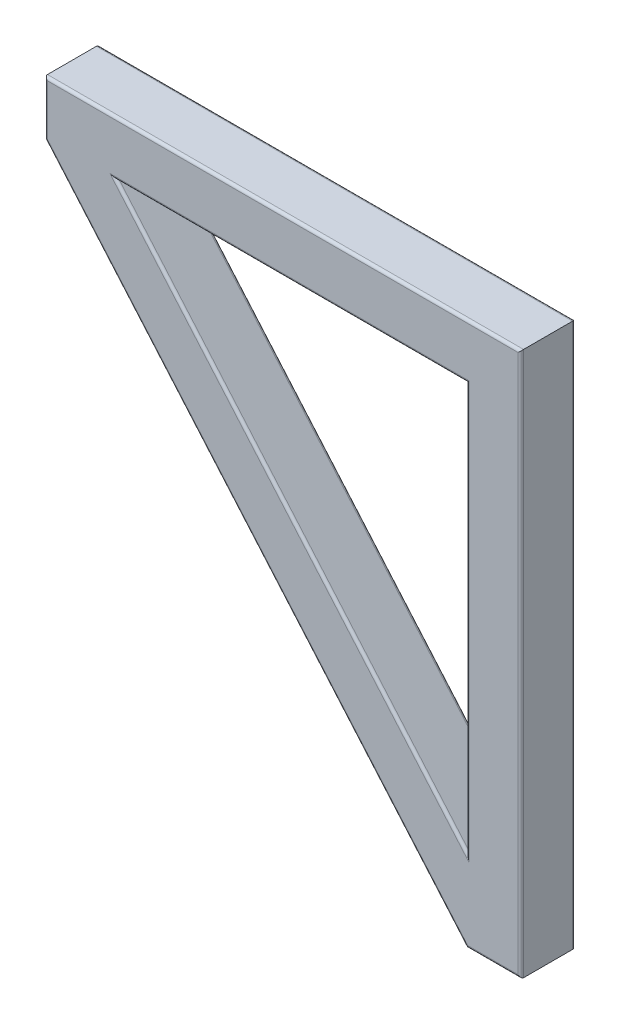
ISO-10303-21;
HEADER;
FILE_DESCRIPTION(('STEP AP214'),'2;1');
FILE_NAME('part.step','',(''),(''),'','','');
FILE_SCHEMA(('AUTOMOTIVE_DESIGN { 1 0 10303 214 1 1 1 1 }'));
ENDSEC;
DATA;
#1=APPLICATION_CONTEXT('core data for automotive mechanical design processes');
#2=APPLICATION_PROTOCOL_DEFINITION('international standard','automotive_design',2000,#1);
#3=PRODUCT_CONTEXT('',#1,'mechanical');
#4=PRODUCT('Part','Part','',(#3));
#5=PRODUCT_RELATED_PRODUCT_CATEGORY('part','',(#4));
#6=PRODUCT_DEFINITION_FORMATION('','',#4);
#7=PRODUCT_DEFINITION_CONTEXT('part definition',#1,'design');
#8=PRODUCT_DEFINITION('design','',#6,#7);
#9=PRODUCT_DEFINITION_SHAPE('','',#8);
#10=(LENGTH_UNIT() NAMED_UNIT(*) SI_UNIT(.MILLI.,.METRE.));
#11=(NAMED_UNIT(*) PLANE_ANGLE_UNIT() SI_UNIT($,.RADIAN.));
#12=(NAMED_UNIT(*) SI_UNIT($,.STERADIAN.) SOLID_ANGLE_UNIT());
#13=UNCERTAINTY_MEASURE_WITH_UNIT(LENGTH_MEASURE(1.E-05),#10,'distance_accuracy_value','');
#14=(GEOMETRIC_REPRESENTATION_CONTEXT(3) GLOBAL_UNCERTAINTY_ASSIGNED_CONTEXT((#13)) GLOBAL_UNIT_ASSIGNED_CONTEXT((#10,
#11,#12)) REPRESENTATION_CONTEXT('',''));
#15=CARTESIAN_POINT('',(0.,0.,0.));
#16=DIRECTION('',(0.,0.,1.));
#17=DIRECTION('',(1.,0.,0.));
#18=AXIS2_PLACEMENT_3D('',#15,#16,#17);
#19=CARTESIAN_POINT('',(0.,0.,40.));
#20=DIRECTION('',(0.,0.,1.));
#21=DIRECTION('',(1.,0.,0.));
#22=AXIS2_PLACEMENT_3D('',#19,#20,#21);
#23=PLANE('',#22);
#24=DIRECTION('',(0.652523135359877,-0.757768802353406,0.));
#25=VECTOR('',#24,1.);
#26=CARTESIAN_POINT('',(5.49093057168311,4.72830132561601,40.));
#27=LINE('',#26,#25);
#28=CARTESIAN_POINT('',(-38.,55.2338981185382,40.));
#29=VERTEX_POINT('',#28);
#30=CARTESIAN_POINT('',(-302.15969884237,362.,40.));
#31=VERTEX_POINT('',#30);
#32=EDGE_CURVE('E113',#29,#31,#27,.F.);
#33=ORIENTED_EDGE('',*,*,#32,.T.);
#34=DIRECTION('',(-1.,0.,0.));
#35=VECTOR('',#34,1.);
#36=CARTESIAN_POINT('',(0.,362.,40.));
#37=LINE('',#36,#35);
#38=CARTESIAN_POINT('',(-38.,362.,40.));
#39=VERTEX_POINT('',#38);
#40=EDGE_CURVE('E297',#31,#39,#37,.F.);
#41=ORIENTED_EDGE('',*,*,#40,.T.);
#42=DIRECTION('',(0.,1.,0.));
#43=VECTOR('',#42,1.);
#44=CARTESIAN_POINT('',(-38.,0.,40.));
#45=LINE('',#44,#43);
#46=EDGE_CURVE('E117',#39,#29,#45,.F.);
#47=ORIENTED_EDGE('',*,*,#46,.T.);
#48=EDGE_LOOP('',(#33,#41,#47));
#49=FACE_BOUND('',#48,.T.);
#50=DIRECTION('',(0.,-1.,0.));
#51=VECTOR('',#50,1.);
#52=CARTESIAN_POINT('',(-348.,360.,40.));
#53=LINE('',#52,#51);
#54=CARTESIAN_POINT('',(-348.,398.,40.));
#55=VERTEX_POINT('',#54);
#56=CARTESIAN_POINT('',(-348.,360.742444779411,40.));
#57=VERTEX_POINT('',#56);
#58=EDGE_CURVE('E290',#55,#57,#53,.T.);
#59=ORIENTED_EDGE('',*,*,#58,.T.);
#60=DIRECTION('',(0.652523135359877,-0.757768802353406,0.));
#61=VECTOR('',#60,1.);
#62=CARTESIAN_POINT('',(-38.4844623952932,1.30504627071975,40.));
#63=LINE('',#62,#61);
#64=CARTESIAN_POINT('',(-39.0828947732845,2.,40.));
#65=VERTEX_POINT('',#64);
#66=EDGE_CURVE('E292',#57,#65,#63,.T.);
#67=ORIENTED_EDGE('',*,*,#66,.T.);
#68=DIRECTION('',(1.,0.,0.));
#69=VECTOR('',#68,1.);
#70=CARTESIAN_POINT('',(0.,2.,40.));
#71=LINE('',#70,#69);
#72=CARTESIAN_POINT('',(-2.,2.,40.));
#73=VERTEX_POINT('',#72);
#74=EDGE_CURVE('E284',#65,#73,#71,.T.);
#75=ORIENTED_EDGE('',*,*,#74,.T.);
#76=DIRECTION('',(0.,1.,0.));
#77=VECTOR('',#76,1.);
#78=CARTESIAN_POINT('',(-2.,400.,40.));
#79=LINE('',#78,#77);
#80=CARTESIAN_POINT('',(-2.,398.,40.));
#81=VERTEX_POINT('',#80);
#82=EDGE_CURVE('E286',#73,#81,#79,.T.);
#83=ORIENTED_EDGE('',*,*,#82,.T.);
#84=DIRECTION('',(-1.,0.,0.));
#85=VECTOR('',#84,1.);
#86=CARTESIAN_POINT('',(-350.,398.,40.));
#87=LINE('',#86,#85);
#88=EDGE_CURVE('E288',#81,#55,#87,.T.);
#89=ORIENTED_EDGE('',*,*,#88,.T.);
#90=EDGE_LOOP('',(#59,#67,#75,#83,#89));
#91=FACE_BOUND('',#90,.T.);
#92=ADVANCED_FACE('F34',(#49,#91),#23,.T.);
#93=CARTESIAN_POINT('',(0.,0.,0.));
#94=DIRECTION('',(0.,0.,1.));
#95=DIRECTION('',(1.,0.,0.));
#96=AXIS2_PLACEMENT_3D('',#93,#94,#95);
#97=PLANE('',#96);
#98=DIRECTION('',(0.,1.,0.));
#99=VECTOR('',#98,1.);
#100=CARTESIAN_POINT('',(-38.,360.,0.));
#101=LINE('',#100,#99);
#102=CARTESIAN_POINT('',(-38.,55.2338981185383,0.));
#103=VERTEX_POINT('',#102);
#104=CARTESIAN_POINT('',(-38.,362.,0.));
#105=VERTEX_POINT('',#104);
#106=EDGE_CURVE('E240',#103,#105,#101,.T.);
#107=ORIENTED_EDGE('',*,*,#106,.T.);
#108=DIRECTION('',(-1.,0.,0.));
#109=VECTOR('',#108,1.);
#110=CARTESIAN_POINT('',(-297.79814917121,362.,0.));
#111=LINE('',#110,#109);
#112=CARTESIAN_POINT('',(-302.15969884237,362.,0.));
#113=VERTEX_POINT('',#112);
#114=EDGE_CURVE('E247',#105,#113,#111,.T.);
#115=ORIENTED_EDGE('',*,*,#114,.T.);
#116=DIRECTION('',(0.652523135359877,-0.757768802353406,0.));
#117=VECTOR('',#116,1.);
#118=CARTESIAN_POINT('',(-41.5155376047068,59.3164579175526,0.));
#119=LINE('',#118,#117);
#120=EDGE_CURVE('E238',#113,#103,#119,.T.);
#121=ORIENTED_EDGE('',*,*,#120,.T.);
#122=EDGE_LOOP('',(#107,#115,#121));
#123=FACE_BOUND('',#122,.T.);
#124=DIRECTION('',(-1.,0.,0.));
#125=VECTOR('',#124,1.);
#126=CARTESIAN_POINT('',(0.,398.,0.));
#127=LINE('',#126,#125);
#128=CARTESIAN_POINT('',(-348.,398.,0.));
#129=VERTEX_POINT('',#128);
#130=CARTESIAN_POINT('',(-2.,398.,0.));
#131=VERTEX_POINT('',#130);
#132=EDGE_CURVE('E237',#129,#131,#127,.F.);
#133=ORIENTED_EDGE('',*,*,#132,.T.);
#134=DIRECTION('',(0.,1.,0.));
#135=VECTOR('',#134,1.);
#136=CARTESIAN_POINT('',(-2.,0.,0.));
#137=LINE('',#136,#135);
#138=CARTESIAN_POINT('',(-2.,2.,0.));
#139=VERTEX_POINT('',#138);
#140=EDGE_CURVE('E216',#131,#139,#137,.F.);
#141=ORIENTED_EDGE('',*,*,#140,.T.);
#142=DIRECTION('',(1.,0.,0.));
#143=VECTOR('',#142,1.);
#144=CARTESIAN_POINT('',(0.,2.,0.));
#145=LINE('',#144,#143);
#146=CARTESIAN_POINT('',(-39.0828947732845,2.,0.));
#147=VERTEX_POINT('',#146);
#148=EDGE_CURVE('E226',#139,#147,#145,.F.);
#149=ORIENTED_EDGE('',*,*,#148,.T.);
#150=DIRECTION('',(0.652523135359877,-0.757768802353406,0.));
#151=VECTOR('',#150,1.);
#152=CARTESIAN_POINT('',(-21.4530047080978,-18.473420720862,0.));
#153=LINE('',#152,#151);
#154=CARTESIAN_POINT('',(-348.,360.742444779412,0.));
#155=VERTEX_POINT('',#154);
#156=EDGE_CURVE('E232',#147,#155,#153,.F.);
#157=ORIENTED_EDGE('',*,*,#156,.T.);
#158=DIRECTION('',(0.,-1.,0.));
#159=VECTOR('',#158,1.);
#160=CARTESIAN_POINT('',(-348.,0.,0.));
#161=LINE('',#160,#159);
#162=EDGE_CURVE('E242',#155,#129,#161,.F.);
#163=ORIENTED_EDGE('',*,*,#162,.T.);
#164=EDGE_LOOP('',(#133,#141,#149,#157,#163));
#165=FACE_BOUND('',#164,.T.);
#166=ADVANCED_FACE('F235',(#123,#165),#97,.F.);
#167=CARTESIAN_POINT('',(-40.,0.,40.));
#168=DIRECTION('',(0.,1.,0.));
#169=DIRECTION('',(0.,0.,1.));
#170=AXIS2_PLACEMENT_3D('',#167,#168,#169);
#171=PLANE('',#170);
#172=DIRECTION('',(0.,0.,-1.));
#173=VECTOR('',#172,1.);
#174=CARTESIAN_POINT('',(-40.,0.,40.));
#175=LINE('',#174,#173);
#176=CARTESIAN_POINT('',(-40.,0.,38.));
#177=VERTEX_POINT('',#176);
#178=CARTESIAN_POINT('',(-40.,0.,2.));
#179=VERTEX_POINT('',#178);
#180=EDGE_CURVE('E782',#177,#179,#175,.T.);
#181=ORIENTED_EDGE('',*,*,#180,.T.);
#182=DIRECTION('',(1.,0.,0.));
#183=VECTOR('',#182,1.);
#184=CARTESIAN_POINT('',(-40.,0.,2.));
#185=LINE('',#184,#183);
#186=CARTESIAN_POINT('',(0.,0.,2.));
#187=VERTEX_POINT('',#186);
#188=EDGE_CURVE('E282',#179,#187,#185,.T.);
#189=ORIENTED_EDGE('',*,*,#188,.T.);
#190=DIRECTION('',(0.,0.,-1.));
#191=VECTOR('',#190,1.);
#192=CARTESIAN_POINT('',(0.,0.,40.));
#193=LINE('',#192,#191);
#194=CARTESIAN_POINT('',(0.,0.,38.));
#195=VERTEX_POINT('',#194);
#196=EDGE_CURVE('E233',#195,#187,#193,.T.);
#197=ORIENTED_EDGE('',*,*,#196,.F.);
#198=DIRECTION('',(1.,0.,0.));
#199=VECTOR('',#198,1.);
#200=CARTESIAN_POINT('',(-40.,0.,38.));
#201=LINE('',#200,#199);
#202=EDGE_CURVE('E280',#195,#177,#201,.F.);
#203=ORIENTED_EDGE('',*,*,#202,.T.);
#204=EDGE_LOOP('',(#181,#189,#197,#203));
#205=FACE_BOUND('',#204,.T.);
#206=ADVANCED_FACE('F692',(#205),#171,.F.);
#207=CARTESIAN_POINT('',(0.,0.,40.));
#208=DIRECTION('',(-1.,0.,0.));
#209=DIRECTION('',(0.,0.,1.));
#210=AXIS2_PLACEMENT_3D('',#207,#208,#209);
#211=PLANE('',#210);
#212=ORIENTED_EDGE('',*,*,#196,.T.);
#213=DIRECTION('',(0.,1.,0.));
#214=VECTOR('',#213,1.);
#215=CARTESIAN_POINT('',(0.,0.,2.));
#216=LINE('',#215,#214);
#217=CARTESIAN_POINT('',(0.,400.,2.));
#218=VERTEX_POINT('',#217);
#219=EDGE_CURVE('E219',#187,#218,#216,.T.);
#220=ORIENTED_EDGE('',*,*,#219,.T.);
#221=DIRECTION('',(0.,0.,-1.));
#222=VECTOR('',#221,1.);
#223=CARTESIAN_POINT('',(0.,400.,40.));
#224=LINE('',#223,#222);
#225=CARTESIAN_POINT('',(0.,400.,38.));
#226=VERTEX_POINT('',#225);
#227=EDGE_CURVE('E763',#226,#218,#224,.T.);
#228=ORIENTED_EDGE('',*,*,#227,.F.);
#229=DIRECTION('',(0.,1.,0.));
#230=VECTOR('',#229,1.);
#231=CARTESIAN_POINT('',(0.,0.,38.));
#232=LINE('',#231,#230);
#233=EDGE_CURVE('E264',#226,#195,#232,.F.);
#234=ORIENTED_EDGE('',*,*,#233,.T.);
#235=EDGE_LOOP('',(#212,#220,#228,#234));
#236=FACE_BOUND('',#235,.T.);
#237=ADVANCED_FACE('F683',(#236),#211,.F.);
#238=CARTESIAN_POINT('',(0.,400.,40.));
#239=DIRECTION('',(0.,-1.,0.));
#240=DIRECTION('',(0.,0.,-1.));
#241=AXIS2_PLACEMENT_3D('',#238,#239,#240);
#242=PLANE('',#241);
#243=ORIENTED_EDGE('',*,*,#227,.T.);
#244=DIRECTION('',(-1.,0.,0.));
#245=VECTOR('',#244,1.);
#246=CARTESIAN_POINT('',(0.,400.,2.));
#247=LINE('',#246,#245);
#248=CARTESIAN_POINT('',(-350.,400.,2.));
#249=VERTEX_POINT('',#248);
#250=EDGE_CURVE('E269',#218,#249,#247,.T.);
#251=ORIENTED_EDGE('',*,*,#250,.T.);
#252=DIRECTION('',(0.,0.,-1.));
#253=VECTOR('',#252,1.);
#254=CARTESIAN_POINT('',(-350.,400.,40.));
#255=LINE('',#254,#253);
#256=CARTESIAN_POINT('',(-350.,400.,38.));
#257=VERTEX_POINT('',#256);
#258=EDGE_CURVE('E765',#257,#249,#255,.T.);
#259=ORIENTED_EDGE('',*,*,#258,.F.);
#260=DIRECTION('',(-1.,0.,0.));
#261=VECTOR('',#260,1.);
#262=CARTESIAN_POINT('',(0.,400.,38.));
#263=LINE('',#262,#261);
#264=EDGE_CURVE('E267',#257,#226,#263,.F.);
#265=ORIENTED_EDGE('',*,*,#264,.T.);
#266=EDGE_LOOP('',(#243,#251,#259,#265));
#267=FACE_BOUND('',#266,.T.);
#268=ADVANCED_FACE('F674',(#267),#242,.F.);
#269=CARTESIAN_POINT('',(-350.,400.,40.));
#270=DIRECTION('',(1.,0.,0.));
#271=DIRECTION('',(0.,0.,-1.));
#272=AXIS2_PLACEMENT_3D('',#269,#270,#271);
#273=PLANE('',#272);
#274=ORIENTED_EDGE('',*,*,#258,.T.);
#275=DIRECTION('',(0.,-1.,0.));
#276=VECTOR('',#275,1.);
#277=CARTESIAN_POINT('',(-350.,400.,2.));
#278=LINE('',#277,#276);
#279=CARTESIAN_POINT('',(-350.,360.,2.));
#280=VERTEX_POINT('',#279);
#281=EDGE_CURVE('E273',#249,#280,#278,.T.);
#282=ORIENTED_EDGE('',*,*,#281,.T.);
#283=DIRECTION('',(0.,0.,-1.));
#284=VECTOR('',#283,1.);
#285=CARTESIAN_POINT('',(-350.,360.,40.));
#286=LINE('',#285,#284);
#287=CARTESIAN_POINT('',(-350.,360.,38.));
#288=VERTEX_POINT('',#287);
#289=EDGE_CURVE('E770',#288,#280,#286,.T.);
#290=ORIENTED_EDGE('',*,*,#289,.F.);
#291=DIRECTION('',(0.,-1.,0.));
#292=VECTOR('',#291,1.);
#293=CARTESIAN_POINT('',(-350.,400.,38.));
#294=LINE('',#293,#292);
#295=EDGE_CURVE('E271',#288,#257,#294,.F.);
#296=ORIENTED_EDGE('',*,*,#295,.T.);
#297=EDGE_LOOP('',(#274,#282,#290,#296));
#298=FACE_BOUND('',#297,.T.);
#299=ADVANCED_FACE('F665',(#298),#273,.F.);
#300=CARTESIAN_POINT('',(-40.,0.,40.));
#301=DIRECTION('',(0.757768802353406,0.652523135359877,0.));
#302=DIRECTION('',(-0.652523135359877,0.757768802353406,0.));
#303=AXIS2_PLACEMENT_3D('',#300,#301,#302);
#304=PLANE('',#303);
#305=ORIENTED_EDGE('',*,*,#289,.T.);
#306=DIRECTION('',(0.652523135359877,-0.757768802353406,0.));
#307=VECTOR('',#306,1.);
#308=CARTESIAN_POINT('',(-40.,0.,2.));
#309=LINE('',#308,#307);
#310=EDGE_CURVE('E278',#280,#179,#309,.T.);
#311=ORIENTED_EDGE('',*,*,#310,.T.);
#312=ORIENTED_EDGE('',*,*,#180,.F.);
#313=DIRECTION('',(0.652523135359877,-0.757768802353406,0.));
#314=VECTOR('',#313,1.);
#315=CARTESIAN_POINT('',(-350.,360.,38.));
#316=LINE('',#315,#314);
#317=EDGE_CURVE('E275',#177,#288,#316,.F.);
#318=ORIENTED_EDGE('',*,*,#317,.T.);
#319=EDGE_LOOP('',(#305,#311,#312,#318));
#320=FACE_BOUND('',#319,.T.);
#321=ADVANCED_FACE('F656',(#320),#304,.F.);
#322=CARTESIAN_POINT('',(-297.79814917121,360.,40.));
#323=DIRECTION('',(0.757768802353406,0.652523135359877,0.));
#324=DIRECTION('',(-0.652523135359877,0.757768802353406,0.));
#325=AXIS2_PLACEMENT_3D('',#322,#323,#324);
#326=PLANE('',#325);
#327=DIRECTION('',(0.,0.,-1.));
#328=VECTOR('',#327,1.);
#329=CARTESIAN_POINT('',(-40.,60.6215041882724,40.));
#330=LINE('',#329,#328);
#331=CARTESIAN_POINT('',(-40.,60.6215041882724,38.));
#332=VERTEX_POINT('',#331);
#333=CARTESIAN_POINT('',(-40.,60.6215041882724,1.99999999999999));
#334=VERTEX_POINT('',#333);
#335=EDGE_CURVE('E784',#332,#334,#330,.T.);
#336=ORIENTED_EDGE('',*,*,#335,.T.);
#337=DIRECTION('',(0.652523135359877,-0.757768802353406,0.));
#338=VECTOR('',#337,1.);
#339=CARTESIAN_POINT('',(-297.79814917121,360.,2.));
#340=LINE('',#339,#338);
#341=CARTESIAN_POINT('',(-297.79814917121,360.,2.));
#342=VERTEX_POINT('',#341);
#343=EDGE_CURVE('E262',#334,#342,#340,.F.);
#344=ORIENTED_EDGE('',*,*,#343,.T.);
#345=DIRECTION('',(0.,0.,-1.));
#346=VECTOR('',#345,1.);
#347=CARTESIAN_POINT('',(-297.79814917121,360.,40.));
#348=LINE('',#347,#346);
#349=CARTESIAN_POINT('',(-297.79814917121,360.,38.));
#350=VERTEX_POINT('',#349);
#351=EDGE_CURVE('E307',#350,#342,#348,.T.);
#352=ORIENTED_EDGE('',*,*,#351,.F.);
#353=DIRECTION('',(0.652523135359877,-0.757768802353406,0.));
#354=VECTOR('',#353,1.);
#355=CARTESIAN_POINT('',(-297.79814917121,360.,38.));
#356=LINE('',#355,#354);
#357=EDGE_CURVE('E260',#350,#332,#356,.T.);
#358=ORIENTED_EDGE('',*,*,#357,.T.);
#359=EDGE_LOOP('',(#336,#344,#352,#358));
#360=FACE_BOUND('',#359,.T.);
#361=ADVANCED_FACE('F647',(#360),#326,.T.);
#362=CARTESIAN_POINT('',(-40.,360.,40.));
#363=DIRECTION('',(-1.,0.,0.));
#364=DIRECTION('',(0.,-1.,0.));
#365=AXIS2_PLACEMENT_3D('',#362,#363,#364);
#366=PLANE('',#365);
#367=DIRECTION('',(0.,0.,-1.));
#368=VECTOR('',#367,1.);
#369=CARTESIAN_POINT('',(-40.,360.,40.));
#370=LINE('',#369,#368);
#371=CARTESIAN_POINT('',(-40.,360.,38.));
#372=VERTEX_POINT('',#371);
#373=CARTESIAN_POINT('',(-40.,360.,2.));
#374=VERTEX_POINT('',#373);
#375=EDGE_CURVE('E789',#372,#374,#370,.T.);
#376=ORIENTED_EDGE('',*,*,#375,.T.);
#377=DIRECTION('',(0.,1.,0.));
#378=VECTOR('',#377,1.);
#379=CARTESIAN_POINT('',(-40.,60.6215041882724,2.));
#380=LINE('',#379,#378);
#381=EDGE_CURVE('E258',#374,#334,#380,.F.);
#382=ORIENTED_EDGE('',*,*,#381,.T.);
#383=ORIENTED_EDGE('',*,*,#335,.F.);
#384=DIRECTION('',(0.,1.,0.));
#385=VECTOR('',#384,1.);
#386=CARTESIAN_POINT('',(-40.,360.,38.));
#387=LINE('',#386,#385);
#388=EDGE_CURVE('E256',#332,#372,#387,.T.);
#389=ORIENTED_EDGE('',*,*,#388,.T.);
#390=EDGE_LOOP('',(#376,#382,#383,#389));
#391=FACE_BOUND('',#390,.T.);
#392=ADVANCED_FACE('F638',(#391),#366,.T.);
#393=CARTESIAN_POINT('',(-297.79814917121,360.,40.));
#394=DIRECTION('',(0.,-1.,0.));
#395=DIRECTION('',(1.,0.,0.));
#396=AXIS2_PLACEMENT_3D('',#393,#394,#395);
#397=PLANE('',#396);
#398=ORIENTED_EDGE('',*,*,#351,.T.);
#399=DIRECTION('',(-1.,0.,0.));
#400=VECTOR('',#399,1.);
#401=CARTESIAN_POINT('',(-40.,360.,2.));
#402=LINE('',#401,#400);
#403=EDGE_CURVE('E253',#342,#374,#402,.F.);
#404=ORIENTED_EDGE('',*,*,#403,.T.);
#405=ORIENTED_EDGE('',*,*,#375,.F.);
#406=DIRECTION('',(-1.,0.,0.));
#407=VECTOR('',#406,1.);
#408=CARTESIAN_POINT('',(-297.79814917121,360.,38.));
#409=LINE('',#408,#407);
#410=EDGE_CURVE('E250',#372,#350,#409,.T.);
#411=ORIENTED_EDGE('',*,*,#410,.T.);
#412=EDGE_LOOP('',(#398,#404,#405,#411));
#413=FACE_BOUND('',#412,.T.);
#414=ADVANCED_FACE('F629',(#413),#397,.T.);
#415=CARTESIAN_POINT('',(-38.,0.,2.));
#416=DIRECTION('',(0.,-1.,0.));
#417=DIRECTION('',(1.,0.,0.));
#418=AXIS2_PLACEMENT_3D('',#415,#416,#417);
#419=CYLINDRICAL_SURFACE('',#418,2.);
#420=CARTESIAN_POINT('',(-38.,362.,2.));
#421=DIRECTION('',(0.707106781186548,-0.707106781186547,0.));
#422=DIRECTION('',(0.707106781186547,0.707106781186548,0.));
#423=AXIS2_PLACEMENT_3D('',#420,#421,#422);
#424=ELLIPSE('',#423,2.82842712474619,2.);
#425=EDGE_CURVE('E301',#105,#374,#424,.F.);
#426=ORIENTED_EDGE('',*,*,#425,.F.);
#427=ORIENTED_EDGE('',*,*,#106,.F.);
#428=CARTESIAN_POINT('',(-38.,55.2338981185383,2.));
#429=DIRECTION('',(-0.937488347221822,-0.348016664576995,0.));
#430=DIRECTION('',(0.348016664576996,-0.937488347221822,0.));
#431=AXIS2_PLACEMENT_3D('',#428,#429,#430);
#432=ELLIPSE('',#431,5.74685123895128,2.);
#433=EDGE_CURVE('E304',#334,#103,#432,.T.);
#434=ORIENTED_EDGE('',*,*,#433,.F.);
#435=ORIENTED_EDGE('',*,*,#381,.F.);
#436=EDGE_LOOP('',(#426,#427,#434,#435));
#437=FACE_BOUND('',#436,.T.);
#438=ADVANCED_FACE('F620',(#437),#419,.T.);
#439=CARTESIAN_POINT('',(5.49093057168311,4.72830132561601,2.));
#440=DIRECTION('',(-0.652523135359877,0.757768802353406,0.));
#441=DIRECTION('',(-0.757768802353406,-0.652523135359877,0.));
#442=AXIS2_PLACEMENT_3D('',#439,#440,#441);
#443=CYLINDRICAL_SURFACE('',#442,2.);
#444=ORIENTED_EDGE('',*,*,#433,.T.);
#445=ORIENTED_EDGE('',*,*,#120,.F.);
#446=CARTESIAN_POINT('',(-302.15969884237,362.,2.));
#447=DIRECTION('',(0.416819424115601,0.908989311092237,0.));
#448=DIRECTION('',(0.908989311092237,-0.416819424115601,0.));
#449=AXIS2_PLACEMENT_3D('',#446,#447,#448);
#450=ELLIPSE('',#449,4.79824087911344,2.);
#451=EDGE_CURVE('E299',#342,#113,#450,.T.);
#452=ORIENTED_EDGE('',*,*,#451,.F.);
#453=ORIENTED_EDGE('',*,*,#343,.F.);
#454=EDGE_LOOP('',(#444,#445,#452,#453));
#455=FACE_BOUND('',#454,.T.);
#456=ADVANCED_FACE('F611',(#455),#443,.T.);
#457=CARTESIAN_POINT('',(0.,362.,2.));
#458=DIRECTION('',(1.,0.,0.));
#459=DIRECTION('',(0.,1.,0.));
#460=AXIS2_PLACEMENT_3D('',#457,#458,#459);
#461=CYLINDRICAL_SURFACE('',#460,2.);
#462=ORIENTED_EDGE('',*,*,#425,.T.);
#463=ORIENTED_EDGE('',*,*,#403,.F.);
#464=ORIENTED_EDGE('',*,*,#451,.T.);
#465=ORIENTED_EDGE('',*,*,#114,.F.);
#466=EDGE_LOOP('',(#462,#463,#464,#465));
#467=FACE_BOUND('',#466,.T.);
#468=ADVANCED_FACE('F602',(#467),#461,.T.);
#469=CARTESIAN_POINT('',(-38.4844623952932,1.30504627071975,2.));
#470=DIRECTION('',(0.652523135359877,-0.757768802353406,0.));
#471=DIRECTION('',(0.757768802353406,0.652523135359877,0.));
#472=AXIS2_PLACEMENT_3D('',#469,#470,#471);
#473=CYLINDRICAL_SURFACE('',#472,2.);
#474=CARTESIAN_POINT('',(-39.0828947732845,2.,2.));
#475=DIRECTION('',(0.908989311092237,-0.416819424115601,0.));
#476=DIRECTION('',(0.416819424115601,0.908989311092237,0.));
#477=AXIS2_PLACEMENT_3D('',#474,#475,#476);
#478=ELLIPSE('',#477,2.20024589463743,2.);
#479=EDGE_CURVE('E229',#179,#147,#478,.T.);
#480=ORIENTED_EDGE('',*,*,#479,.F.);
#481=ORIENTED_EDGE('',*,*,#310,.F.);
#482=CARTESIAN_POINT('',(-348.,360.742444779412,2.));
#483=DIRECTION('',(0.348016664576996,-0.937488347221822,0.));
#484=DIRECTION('',(0.937488347221822,0.348016664576995,0.));
#485=AXIS2_PLACEMENT_3D('',#482,#483,#484);
#486=ELLIPSE('',#485,2.13335985020705,2.);
#487=EDGE_CURVE('E302',#155,#280,#486,.F.);
#488=ORIENTED_EDGE('',*,*,#487,.F.);
#489=ORIENTED_EDGE('',*,*,#156,.F.);
#490=EDGE_LOOP('',(#480,#481,#488,#489));
#491=FACE_BOUND('',#490,.T.);
#492=ADVANCED_FACE('F593',(#491),#473,.T.);
#493=CARTESIAN_POINT('',(-348.,400.,2.));
#494=DIRECTION('',(0.,-1.,0.));
#495=DIRECTION('',(0.,0.,-1.));
#496=AXIS2_PLACEMENT_3D('',#493,#494,#495);
#497=CYLINDRICAL_SURFACE('',#496,2.);
#498=ORIENTED_EDGE('',*,*,#487,.T.);
#499=ORIENTED_EDGE('',*,*,#281,.F.);
#500=CARTESIAN_POINT('',(-348.,398.,2.));
#501=DIRECTION('',(-0.707106781186547,-0.707106781186547,0.));
#502=DIRECTION('',(0.707106781186547,-0.707106781186547,0.));
#503=AXIS2_PLACEMENT_3D('',#500,#501,#502);
#504=ELLIPSE('',#503,2.82842712474619,2.);
#505=EDGE_CURVE('E222',#129,#249,#504,.F.);
#506=ORIENTED_EDGE('',*,*,#505,.F.);
#507=ORIENTED_EDGE('',*,*,#162,.F.);
#508=EDGE_LOOP('',(#498,#499,#506,#507));
#509=FACE_BOUND('',#508,.T.);
#510=ADVANCED_FACE('F585',(#509),#497,.T.);
#511=CARTESIAN_POINT('',(-40.,2.,2.));
#512=DIRECTION('',(1.,0.,0.));
#513=DIRECTION('',(0.,0.,-1.));
#514=AXIS2_PLACEMENT_3D('',#511,#512,#513);
#515=CYLINDRICAL_SURFACE('',#514,2.);
#516=ORIENTED_EDGE('',*,*,#479,.T.);
#517=ORIENTED_EDGE('',*,*,#148,.F.);
#518=CARTESIAN_POINT('',(-2.,2.,2.));
#519=DIRECTION('',(0.707106781186547,0.707106781186547,0.));
#520=DIRECTION('',(0.707106781186547,-0.707106781186547,0.));
#521=AXIS2_PLACEMENT_3D('',#518,#519,#520);
#522=ELLIPSE('',#521,2.82842712474619,2.);
#523=EDGE_CURVE('E212',#187,#139,#522,.T.);
#524=ORIENTED_EDGE('',*,*,#523,.F.);
#525=ORIENTED_EDGE('',*,*,#188,.F.);
#526=EDGE_LOOP('',(#516,#517,#524,#525));
#527=FACE_BOUND('',#526,.T.);
#528=ADVANCED_FACE('F227',(#527),#515,.T.);
#529=CARTESIAN_POINT('',(0.,398.,2.));
#530=DIRECTION('',(-1.,0.,0.));
#531=DIRECTION('',(0.,0.,1.));
#532=AXIS2_PLACEMENT_3D('',#529,#530,#531);
#533=CYLINDRICAL_SURFACE('',#532,2.);
#534=ORIENTED_EDGE('',*,*,#505,.T.);
#535=ORIENTED_EDGE('',*,*,#250,.F.);
#536=CARTESIAN_POINT('',(-2.,398.,2.));
#537=DIRECTION('',(-0.707106781186547,0.707106781186547,0.));
#538=DIRECTION('',(-0.707106781186547,-0.707106781186547,0.));
#539=AXIS2_PLACEMENT_3D('',#536,#537,#538);
#540=ELLIPSE('',#539,2.82842712474619,2.);
#541=EDGE_CURVE('E223',#131,#218,#540,.F.);
#542=ORIENTED_EDGE('',*,*,#541,.F.);
#543=ORIENTED_EDGE('',*,*,#132,.F.);
#544=EDGE_LOOP('',(#534,#535,#542,#543));
#545=FACE_BOUND('',#544,.T.);
#546=ADVANCED_FACE('F569',(#545),#533,.T.);
#547=CARTESIAN_POINT('',(-2.,0.,2.));
#548=DIRECTION('',(0.,1.,0.));
#549=DIRECTION('',(0.,0.,1.));
#550=AXIS2_PLACEMENT_3D('',#547,#548,#549);
#551=CYLINDRICAL_SURFACE('',#550,2.);
#552=ORIENTED_EDGE('',*,*,#523,.T.);
#553=ORIENTED_EDGE('',*,*,#140,.F.);
#554=ORIENTED_EDGE('',*,*,#541,.T.);
#555=ORIENTED_EDGE('',*,*,#219,.F.);
#556=EDGE_LOOP('',(#552,#553,#554,#555));
#557=FACE_BOUND('',#556,.T.);
#558=ADVANCED_FACE('F214',(#557),#551,.T.);
#559=CARTESIAN_POINT('',(-38.,360.,38.));
#560=DIRECTION('',(0.,1.,0.));
#561=DIRECTION('',(-1.,0.,0.));
#562=AXIS2_PLACEMENT_3D('',#559,#560,#561);
#563=CYLINDRICAL_SURFACE('',#562,2.);
#564=CARTESIAN_POINT('',(-38.,362.,38.));
#565=DIRECTION('',(-0.707106781186548,0.707106781186547,0.));
#566=DIRECTION('',(-0.707106781186547,-0.707106781186548,0.));
#567=AXIS2_PLACEMENT_3D('',#564,#565,#566);
#568=ELLIPSE('',#567,2.82842712474619,2.);
#569=EDGE_CURVE('E317',#372,#39,#568,.T.);
#570=ORIENTED_EDGE('',*,*,#569,.F.);
#571=ORIENTED_EDGE('',*,*,#388,.F.);
#572=CARTESIAN_POINT('',(-38.,55.2338981185383,38.));
#573=DIRECTION('',(0.937488347221822,0.348016664576995,0.));
#574=DIRECTION('',(0.348016664576996,-0.937488347221822,0.));
#575=AXIS2_PLACEMENT_3D('',#572,#573,#574);
#576=ELLIPSE('',#575,5.74685123895128,2.);
#577=EDGE_CURVE('E308',#29,#332,#576,.F.);
#578=ORIENTED_EDGE('',*,*,#577,.F.);
#579=ORIENTED_EDGE('',*,*,#46,.F.);
#580=EDGE_LOOP('',(#570,#571,#578,#579));
#581=FACE_BOUND('',#580,.T.);
#582=ADVANCED_FACE('F552',(#581),#563,.T.);
#583=CARTESIAN_POINT('',(-299.313686775917,358.69495372928,38.));
#584=DIRECTION('',(0.652523135359877,-0.757768802353406,0.));
#585=DIRECTION('',(0.757768802353406,0.652523135359877,0.));
#586=AXIS2_PLACEMENT_3D('',#583,#584,#585);
#587=CYLINDRICAL_SURFACE('',#586,2.);
#588=ORIENTED_EDGE('',*,*,#577,.T.);
#589=ORIENTED_EDGE('',*,*,#357,.F.);
#590=CARTESIAN_POINT('',(-302.15969884237,362.,38.));
#591=DIRECTION('',(-0.416819424115601,-0.908989311092237,0.));
#592=DIRECTION('',(-0.908989311092237,0.416819424115601,0.));
#593=AXIS2_PLACEMENT_3D('',#590,#591,#592);
#594=ELLIPSE('',#593,4.79824087911344,2.);
#595=EDGE_CURVE('E315',#31,#350,#594,.F.);
#596=ORIENTED_EDGE('',*,*,#595,.F.);
#597=ORIENTED_EDGE('',*,*,#32,.F.);
#598=EDGE_LOOP('',(#588,#589,#596,#597));
#599=FACE_BOUND('',#598,.T.);
#600=ADVANCED_FACE('F543',(#599),#587,.T.);
#601=CARTESIAN_POINT('',(-297.79814917121,362.,38.));
#602=DIRECTION('',(-1.,0.,0.));
#603=DIRECTION('',(0.,-1.,0.));
#604=AXIS2_PLACEMENT_3D('',#601,#602,#603);
#605=CYLINDRICAL_SURFACE('',#604,2.);
#606=ORIENTED_EDGE('',*,*,#569,.T.);
#607=ORIENTED_EDGE('',*,*,#40,.F.);
#608=ORIENTED_EDGE('',*,*,#595,.T.);
#609=ORIENTED_EDGE('',*,*,#410,.F.);
#610=EDGE_LOOP('',(#606,#607,#608,#609));
#611=FACE_BOUND('',#610,.T.);
#612=ADVANCED_FACE('F535',(#611),#605,.T.);
#613=CARTESIAN_POINT('',(0.,398.,38.));
#614=DIRECTION('',(1.,0.,0.));
#615=DIRECTION('',(0.,0.,-1.));
#616=AXIS2_PLACEMENT_3D('',#613,#614,#615);
#617=CYLINDRICAL_SURFACE('',#616,2.);
#618=CARTESIAN_POINT('',(-348.,398.,38.));
#619=DIRECTION('',(0.707106781186547,0.707106781186547,0.));
#620=DIRECTION('',(0.707106781186547,-0.707106781186547,0.));
#621=AXIS2_PLACEMENT_3D('',#618,#619,#620);
#622=ELLIPSE('',#621,2.82842712474619,2.);
#623=EDGE_CURVE('E329',#55,#257,#622,.F.);
#624=ORIENTED_EDGE('',*,*,#623,.F.);
#625=ORIENTED_EDGE('',*,*,#88,.F.);
#626=CARTESIAN_POINT('',(-2.,398.,38.));
#627=DIRECTION('',(0.707106781186547,-0.707106781186547,0.));
#628=DIRECTION('',(-0.707106781186547,-0.707106781186547,0.));
#629=AXIS2_PLACEMENT_3D('',#626,#627,#628);
#630=ELLIPSE('',#629,2.82842712474619,2.);
#631=EDGE_CURVE('E318',#226,#81,#630,.T.);
#632=ORIENTED_EDGE('',*,*,#631,.F.);
#633=ORIENTED_EDGE('',*,*,#264,.F.);
#634=EDGE_LOOP('',(#624,#625,#632,#633));
#635=FACE_BOUND('',#634,.T.);
#636=ADVANCED_FACE('F424',(#635),#617,.T.);
#637=CARTESIAN_POINT('',(-2.,0.,38.));
#638=DIRECTION('',(0.,-1.,0.));
#639=DIRECTION('',(0.,0.,-1.));
#640=AXIS2_PLACEMENT_3D('',#637,#638,#639);
#641=CYLINDRICAL_SURFACE('',#640,2.);
#642=ORIENTED_EDGE('',*,*,#631,.T.);
#643=ORIENTED_EDGE('',*,*,#82,.F.);
#644=CARTESIAN_POINT('',(-2.,2.,38.));
#645=DIRECTION('',(-0.707106781186547,-0.707106781186547,0.));
#646=DIRECTION('',(-0.707106781186547,0.707106781186547,0.));
#647=AXIS2_PLACEMENT_3D('',#644,#645,#646);
#648=ELLIPSE('',#647,2.82842712474619,2.);
#649=EDGE_CURVE('E326',#195,#73,#648,.T.);
#650=ORIENTED_EDGE('',*,*,#649,.F.);
#651=ORIENTED_EDGE('',*,*,#233,.F.);
#652=EDGE_LOOP('',(#642,#643,#650,#651));
#653=FACE_BOUND('',#652,.T.);
#654=ADVANCED_FACE('F519',(#653),#641,.T.);
#655=CARTESIAN_POINT('',(-348.,0.,38.));
#656=DIRECTION('',(0.,1.,0.));
#657=DIRECTION('',(0.,0.,1.));
#658=AXIS2_PLACEMENT_3D('',#655,#656,#657);
#659=CYLINDRICAL_SURFACE('',#658,2.);
#660=ORIENTED_EDGE('',*,*,#623,.T.);
#661=ORIENTED_EDGE('',*,*,#295,.F.);
#662=CARTESIAN_POINT('',(-348.,360.742444779411,38.));
#663=DIRECTION('',(-0.348016664576996,0.937488347221822,0.));
#664=DIRECTION('',(0.937488347221822,0.348016664576995,0.));
#665=AXIS2_PLACEMENT_3D('',#662,#663,#664);
#666=ELLIPSE('',#665,2.13335985020705,2.);
#667=EDGE_CURVE('E324',#57,#288,#666,.F.);
#668=ORIENTED_EDGE('',*,*,#667,.F.);
#669=ORIENTED_EDGE('',*,*,#58,.F.);
#670=EDGE_LOOP('',(#660,#661,#668,#669));
#671=FACE_BOUND('',#670,.T.);
#672=ADVANCED_FACE('F510',(#671),#659,.T.);
#673=CARTESIAN_POINT('',(0.,2.,38.));
#674=DIRECTION('',(-1.,0.,0.));
#675=DIRECTION('',(0.,0.,1.));
#676=AXIS2_PLACEMENT_3D('',#673,#674,#675);
#677=CYLINDRICAL_SURFACE('',#676,2.);
#678=ORIENTED_EDGE('',*,*,#649,.T.);
#679=ORIENTED_EDGE('',*,*,#74,.F.);
#680=CARTESIAN_POINT('',(-39.0828947732845,2.,38.));
#681=DIRECTION('',(-0.908989311092237,0.416819424115601,0.));
#682=DIRECTION('',(-0.416819424115601,-0.908989311092237,0.));
#683=AXIS2_PLACEMENT_3D('',#680,#681,#682);
#684=ELLIPSE('',#683,2.20024589463743,2.);
#685=EDGE_CURVE('E322',#177,#65,#684,.T.);
#686=ORIENTED_EDGE('',*,*,#685,.F.);
#687=ORIENTED_EDGE('',*,*,#202,.F.);
#688=EDGE_LOOP('',(#678,#679,#686,#687));
#689=FACE_BOUND('',#688,.T.);
#690=ADVANCED_FACE('F501',(#689),#677,.T.);
#691=CARTESIAN_POINT('',(-21.4530047080978,-18.473420720862,38.));
#692=DIRECTION('',(-0.652523135359877,0.757768802353406,0.));
#693=DIRECTION('',(-0.757768802353406,-0.652523135359877,0.));
#694=AXIS2_PLACEMENT_3D('',#691,#692,#693);
#695=CYLINDRICAL_SURFACE('',#694,2.);
#696=ORIENTED_EDGE('',*,*,#667,.T.);
#697=ORIENTED_EDGE('',*,*,#317,.F.);
#698=ORIENTED_EDGE('',*,*,#685,.T.);
#699=ORIENTED_EDGE('',*,*,#66,.F.);
#700=EDGE_LOOP('',(#696,#697,#698,#699));
#701=FACE_BOUND('',#700,.T.);
#702=ADVANCED_FACE('F497',(#701),#695,.T.);
#703=CLOSED_SHELL('',(#92,#166,#206,#237,#268,#299,#321,#361,#392,#414,#438,#456,#468,#492,#510,
#528,#546,#558,#582,#600,#612,#636,#654,#672,#690,#702));
#704=CARTESIAN_POINT('',(0.,0.,36.));
#705=DIRECTION('',(0.,0.,1.));
#706=DIRECTION('',(1.,0.,0.));
#707=AXIS2_PLACEMENT_3D('',#704,#705,#706);
#708=PLANE('',#707);
#709=DIRECTION('',(0.652523135359877,-0.757768802353406,0.));
#710=VECTOR('',#709,1.);
#711=CARTESIAN_POINT('',(-300.829224380624,357.38990745856,36.));
#712=LINE('',#711,#710);
#713=CARTESIAN_POINT('',(-306.52124851353,364.,36.));
#714=VERTEX_POINT('',#713);
#715=CARTESIAN_POINT('',(-36.,49.8462920488041,36.));
#716=VERTEX_POINT('',#715);
#717=EDGE_CURVE('E340',#714,#716,#712,.T.);
#718=ORIENTED_EDGE('',*,*,#717,.T.);
#719=DIRECTION('',(0.,1.,0.));
#720=VECTOR('',#719,1.);
#721=CARTESIAN_POINT('',(-36.,360.,36.));
#722=LINE('',#721,#720);
#723=CARTESIAN_POINT('',(-36.,364.,36.));
#724=VERTEX_POINT('',#723);
#725=EDGE_CURVE('E336',#716,#724,#722,.T.);
#726=ORIENTED_EDGE('',*,*,#725,.T.);
#727=DIRECTION('',(1.,0.,0.));
#728=VECTOR('',#727,1.);
#729=CARTESIAN_POINT('',(0.,364.,36.));
#730=LINE('',#729,#728);
#731=EDGE_CURVE('E38',#714,#724,#730,.T.);
#732=ORIENTED_EDGE('',*,*,#731,.F.);
#733=EDGE_LOOP('',(#718,#726,#732));
#734=FACE_BOUND('',#733,.T.);
#735=DIRECTION('',(0.,1.,0.));
#736=VECTOR('',#735,1.);
#737=CARTESIAN_POINT('',(-346.,0.,36.));
#738=LINE('',#737,#736);
#739=CARTESIAN_POINT('',(-346.,361.484889558823,36.));
#740=VERTEX_POINT('',#739);
#741=CARTESIAN_POINT('',(-346.,396.,36.));
#742=VERTEX_POINT('',#741);
#743=EDGE_CURVE('E349',#740,#742,#738,.T.);
#744=ORIENTED_EDGE('',*,*,#743,.T.);
#745=DIRECTION('',(-1.,0.,0.));
#746=VECTOR('',#745,1.);
#747=CARTESIAN_POINT('',(0.,396.,36.));
#748=LINE('',#747,#746);
#749=CARTESIAN_POINT('',(-4.,396.,36.));
#750=VERTEX_POINT('',#749);
#751=EDGE_CURVE('E376',#750,#742,#748,.T.);
#752=ORIENTED_EDGE('',*,*,#751,.F.);
#753=DIRECTION('',(0.,1.,0.));
#754=VECTOR('',#753,1.);
#755=CARTESIAN_POINT('',(-4.,0.,36.));
#756=LINE('',#755,#754);
#757=CARTESIAN_POINT('',(-4.,4.,36.));
#758=VERTEX_POINT('',#757);
#759=EDGE_CURVE('E379',#758,#750,#756,.T.);
#760=ORIENTED_EDGE('',*,*,#759,.F.);
#761=DIRECTION('',(1.,0.,0.));
#762=VECTOR('',#761,1.);
#763=CARTESIAN_POINT('',(-40.,4.,36.));
#764=LINE('',#763,#762);
#765=CARTESIAN_POINT('',(-38.165789546569,4.,36.));
#766=VERTEX_POINT('',#765);
#767=EDGE_CURVE('E380',#766,#758,#764,.T.);
#768=ORIENTED_EDGE('',*,*,#767,.F.);
#769=DIRECTION('',(-0.652523135359877,0.757768802353406,0.));
#770=VECTOR('',#769,1.);
#771=CARTESIAN_POINT('',(-19.937467103391,-17.1683744501422,36.));
#772=LINE('',#771,#770);
#773=EDGE_CURVE('E101',#766,#740,#772,.T.);
#774=ORIENTED_EDGE('',*,*,#773,.T.);
#775=EDGE_LOOP('',(#744,#752,#760,#768,#774));
#776=FACE_BOUND('',#775,.T.);
#777=ADVANCED_FACE('F388',(#734,#776),#708,.F.);
#778=CARTESIAN_POINT('',(0.,0.,4.));
#779=DIRECTION('',(0.,0.,1.));
#780=DIRECTION('',(1.,0.,0.));
#781=AXIS2_PLACEMENT_3D('',#778,#779,#780);
#782=PLANE('',#781);
#783=DIRECTION('',(0.,1.,0.));
#784=VECTOR('',#783,1.);
#785=CARTESIAN_POINT('',(-36.,360.,4.));
#786=LINE('',#785,#784);
#787=CARTESIAN_POINT('',(-36.,49.8462920488041,4.));
#788=VERTEX_POINT('',#787);
#789=CARTESIAN_POINT('',(-36.,364.,4.));
#790=VERTEX_POINT('',#789);
#791=EDGE_CURVE('E373',#788,#790,#786,.T.);
#792=ORIENTED_EDGE('',*,*,#791,.F.);
#793=DIRECTION('',(0.652523135359877,-0.757768802353406,0.));
#794=VECTOR('',#793,1.);
#795=CARTESIAN_POINT('',(-300.829224380624,357.38990745856,4.));
#796=LINE('',#795,#794);
#797=CARTESIAN_POINT('',(-306.52124851353,364.,4.));
#798=VERTEX_POINT('',#797);
#799=EDGE_CURVE('E371',#798,#788,#796,.T.);
#800=ORIENTED_EDGE('',*,*,#799,.F.);
#801=DIRECTION('',(1.,0.,0.));
#802=VECTOR('',#801,1.);
#803=CARTESIAN_POINT('',(0.,364.,4.));
#804=LINE('',#803,#802);
#805=EDGE_CURVE('E11',#798,#790,#804,.T.);
#806=ORIENTED_EDGE('',*,*,#805,.T.);
#807=EDGE_LOOP('',(#792,#800,#806));
#808=FACE_BOUND('',#807,.T.);
#809=DIRECTION('',(-1.,0.,0.));
#810=VECTOR('',#809,1.);
#811=CARTESIAN_POINT('',(0.,396.,4.));
#812=LINE('',#811,#810);
#813=CARTESIAN_POINT('',(-4.,396.,4.));
#814=VERTEX_POINT('',#813);
#815=CARTESIAN_POINT('',(-346.,396.,4.));
#816=VERTEX_POINT('',#815);
#817=EDGE_CURVE('E357',#814,#816,#812,.T.);
#818=ORIENTED_EDGE('',*,*,#817,.T.);
#819=DIRECTION('',(0.,-1.,0.));
#820=VECTOR('',#819,1.);
#821=CARTESIAN_POINT('',(-346.,400.,4.));
#822=LINE('',#821,#820);
#823=CARTESIAN_POINT('',(-346.,361.484889558823,4.));
#824=VERTEX_POINT('',#823);
#825=EDGE_CURVE('E352',#816,#824,#822,.T.);
#826=ORIENTED_EDGE('',*,*,#825,.T.);
#827=DIRECTION('',(0.652523135359877,-0.757768802353406,0.));
#828=VECTOR('',#827,1.);
#829=CARTESIAN_POINT('',(-36.9689247905864,2.61009254143951,4.));
#830=LINE('',#829,#828);
#831=CARTESIAN_POINT('',(-38.165789546569,4.,4.));
#832=VERTEX_POINT('',#831);
#833=EDGE_CURVE('E344',#824,#832,#830,.T.);
#834=ORIENTED_EDGE('',*,*,#833,.T.);
#835=DIRECTION('',(-1.,0.,0.));
#836=VECTOR('',#835,1.);
#837=CARTESIAN_POINT('',(0.,4.,4.));
#838=LINE('',#837,#836);
#839=CARTESIAN_POINT('',(-4.,4.,4.));
#840=VERTEX_POINT('',#839);
#841=EDGE_CURVE('E367',#840,#832,#838,.T.);
#842=ORIENTED_EDGE('',*,*,#841,.F.);
#843=DIRECTION('',(0.,-1.,0.));
#844=VECTOR('',#843,1.);
#845=CARTESIAN_POINT('',(-4.,0.,4.));
#846=LINE('',#845,#844);
#847=EDGE_CURVE('E369',#814,#840,#846,.T.);
#848=ORIENTED_EDGE('',*,*,#847,.F.);
#849=EDGE_LOOP('',(#818,#826,#834,#842,#848));
#850=FACE_BOUND('',#849,.T.);
#851=ADVANCED_FACE('F396',(#808,#850),#782,.T.);
#852=CARTESIAN_POINT('',(-40.,4.,40.));
#853=DIRECTION('',(0.,1.,0.));
#854=DIRECTION('',(0.,0.,1.));
#855=AXIS2_PLACEMENT_3D('',#852,#853,#854);
#856=PLANE('',#855);
#857=DIRECTION('',(0.,0.,-1.));
#858=VECTOR('',#857,1.);
#859=CARTESIAN_POINT('',(-38.165789546569,4.,40.));
#860=LINE('',#859,#858);
#861=EDGE_CURVE('E365',#766,#832,#860,.T.);
#862=ORIENTED_EDGE('',*,*,#861,.F.);
#863=ORIENTED_EDGE('',*,*,#767,.T.);
#864=DIRECTION('',(0.,0.,-1.));
#865=VECTOR('',#864,1.);
#866=CARTESIAN_POINT('',(-4.,4.,40.));
#867=LINE('',#866,#865);
#868=EDGE_CURVE('E362',#758,#840,#867,.T.);
#869=ORIENTED_EDGE('',*,*,#868,.T.);
#870=ORIENTED_EDGE('',*,*,#841,.T.);
#871=EDGE_LOOP('',(#862,#863,#869,#870));
#872=FACE_BOUND('',#871,.T.);
#873=ADVANCED_FACE('F384',(#872),#856,.T.);
#874=CARTESIAN_POINT('',(-4.,0.,40.));
#875=DIRECTION('',(-1.,0.,0.));
#876=DIRECTION('',(0.,0.,1.));
#877=AXIS2_PLACEMENT_3D('',#874,#875,#876);
#878=PLANE('',#877);
#879=ORIENTED_EDGE('',*,*,#868,.F.);
#880=ORIENTED_EDGE('',*,*,#759,.T.);
#881=DIRECTION('',(0.,0.,-1.));
#882=VECTOR('',#881,1.);
#883=CARTESIAN_POINT('',(-4.,396.,40.));
#884=LINE('',#883,#882);
#885=EDGE_CURVE('E360',#750,#814,#884,.T.);
#886=ORIENTED_EDGE('',*,*,#885,.T.);
#887=ORIENTED_EDGE('',*,*,#847,.T.);
#888=EDGE_LOOP('',(#879,#880,#886,#887));
#889=FACE_BOUND('',#888,.T.);
#890=ADVANCED_FACE('F391',(#889),#878,.T.);
#891=CARTESIAN_POINT('',(0.,396.,40.));
#892=DIRECTION('',(0.,-1.,0.));
#893=DIRECTION('',(0.,0.,-1.));
#894=AXIS2_PLACEMENT_3D('',#891,#892,#893);
#895=PLANE('',#894);
#896=ORIENTED_EDGE('',*,*,#885,.F.);
#897=ORIENTED_EDGE('',*,*,#751,.T.);
#898=DIRECTION('',(0.,0.,-1.));
#899=VECTOR('',#898,1.);
#900=CARTESIAN_POINT('',(-346.,396.,40.));
#901=LINE('',#900,#899);
#902=EDGE_CURVE('E355',#742,#816,#901,.T.);
#903=ORIENTED_EDGE('',*,*,#902,.T.);
#904=ORIENTED_EDGE('',*,*,#817,.F.);
#905=EDGE_LOOP('',(#896,#897,#903,#904));
#906=FACE_BOUND('',#905,.T.);
#907=ADVANCED_FACE('F411',(#906),#895,.T.);
#908=CARTESIAN_POINT('',(-346.,400.,40.));
#909=DIRECTION('',(1.,0.,0.));
#910=DIRECTION('',(0.,0.,-1.));
#911=AXIS2_PLACEMENT_3D('',#908,#909,#910);
#912=PLANE('',#911);
#913=ORIENTED_EDGE('',*,*,#902,.F.);
#914=ORIENTED_EDGE('',*,*,#743,.F.);
#915=DIRECTION('',(0.,0.,-1.));
#916=VECTOR('',#915,1.);
#917=CARTESIAN_POINT('',(-346.,361.484889558823,40.));
#918=LINE('',#917,#916);
#919=EDGE_CURVE('E347',#740,#824,#918,.T.);
#920=ORIENTED_EDGE('',*,*,#919,.T.);
#921=ORIENTED_EDGE('',*,*,#825,.F.);
#922=EDGE_LOOP('',(#913,#914,#920,#921));
#923=FACE_BOUND('',#922,.T.);
#924=ADVANCED_FACE('F402',(#923),#912,.T.);
#925=CARTESIAN_POINT('',(-36.9689247905864,2.61009254143951,40.));
#926=DIRECTION('',(0.757768802353406,0.652523135359877,0.));
#927=DIRECTION('',(-0.652523135359877,0.757768802353406,0.));
#928=AXIS2_PLACEMENT_3D('',#925,#926,#927);
#929=PLANE('',#928);
#930=ORIENTED_EDGE('',*,*,#919,.F.);
#931=ORIENTED_EDGE('',*,*,#773,.F.);
#932=ORIENTED_EDGE('',*,*,#861,.T.);
#933=ORIENTED_EDGE('',*,*,#833,.F.);
#934=EDGE_LOOP('',(#930,#931,#932,#933));
#935=FACE_BOUND('',#934,.T.);
#936=ADVANCED_FACE('F399',(#935),#929,.T.);
#937=CARTESIAN_POINT('',(-300.829224380624,357.38990745856,40.));
#938=DIRECTION('',(0.757768802353406,0.652523135359877,0.));
#939=DIRECTION('',(-0.652523135359877,0.757768802353406,0.));
#940=AXIS2_PLACEMENT_3D('',#937,#938,#939);
#941=PLANE('',#940);
#942=DIRECTION('',(0.,0.,-1.));
#943=VECTOR('',#942,1.);
#944=CARTESIAN_POINT('',(-36.,49.8462920488042,40.));
#945=LINE('',#944,#943);
#946=EDGE_CURVE('E54',#716,#788,#945,.T.);
#947=ORIENTED_EDGE('',*,*,#946,.F.);
#948=ORIENTED_EDGE('',*,*,#717,.F.);
#949=DIRECTION('',(0.,0.,-1.));
#950=VECTOR('',#949,1.);
#951=CARTESIAN_POINT('',(-306.52124851353,364.,40.));
#952=LINE('',#951,#950);
#953=EDGE_CURVE('E45',#714,#798,#952,.T.);
#954=ORIENTED_EDGE('',*,*,#953,.T.);
#955=ORIENTED_EDGE('',*,*,#799,.T.);
#956=EDGE_LOOP('',(#947,#948,#954,#955));
#957=FACE_BOUND('',#956,.T.);
#958=ADVANCED_FACE('F401',(#957),#941,.F.);
#959=CARTESIAN_POINT('',(-36.,360.,40.));
#960=DIRECTION('',(-1.,0.,0.));
#961=DIRECTION('',(0.,-1.,0.));
#962=AXIS2_PLACEMENT_3D('',#959,#960,#961);
#963=PLANE('',#962);
#964=DIRECTION('',(0.,0.,-1.));
#965=VECTOR('',#964,1.);
#966=CARTESIAN_POINT('',(-36.,364.,40.));
#967=LINE('',#966,#965);
#968=EDGE_CURVE('E338',#724,#790,#967,.T.);
#969=ORIENTED_EDGE('',*,*,#968,.F.);
#970=ORIENTED_EDGE('',*,*,#725,.F.);
#971=ORIENTED_EDGE('',*,*,#946,.T.);
#972=ORIENTED_EDGE('',*,*,#791,.T.);
#973=EDGE_LOOP('',(#969,#970,#971,#972));
#974=FACE_BOUND('',#973,.T.);
#975=ADVANCED_FACE('F409',(#974),#963,.F.);
#976=CARTESIAN_POINT('',(-297.79814917121,364.,40.));
#977=DIRECTION('',(0.,-1.,0.));
#978=DIRECTION('',(1.,0.,0.));
#979=AXIS2_PLACEMENT_3D('',#976,#977,#978);
#980=PLANE('',#979);
#981=ORIENTED_EDGE('',*,*,#953,.F.);
#982=ORIENTED_EDGE('',*,*,#731,.T.);
#983=ORIENTED_EDGE('',*,*,#968,.T.);
#984=ORIENTED_EDGE('',*,*,#805,.F.);
#985=EDGE_LOOP('',(#981,#982,#983,#984));
#986=FACE_BOUND('',#985,.T.);
#987=ADVANCED_FACE('F36',(#986),#980,.F.);
#988=CLOSED_SHELL('',(#777,#851,#873,#890,#907,#924,#936,#958,#975,#987));
#989=ORIENTED_CLOSED_SHELL('',*,#988,.T.);
#990=BREP_WITH_VOIDS('B2',#703,(#989));
#991=ADVANCED_BREP_SHAPE_REPRESENTATION('',(#18,#990),#14);
#992=SHAPE_DEFINITION_REPRESENTATION(#9,#991);
ENDSEC;
END-ISO-10303-21;
